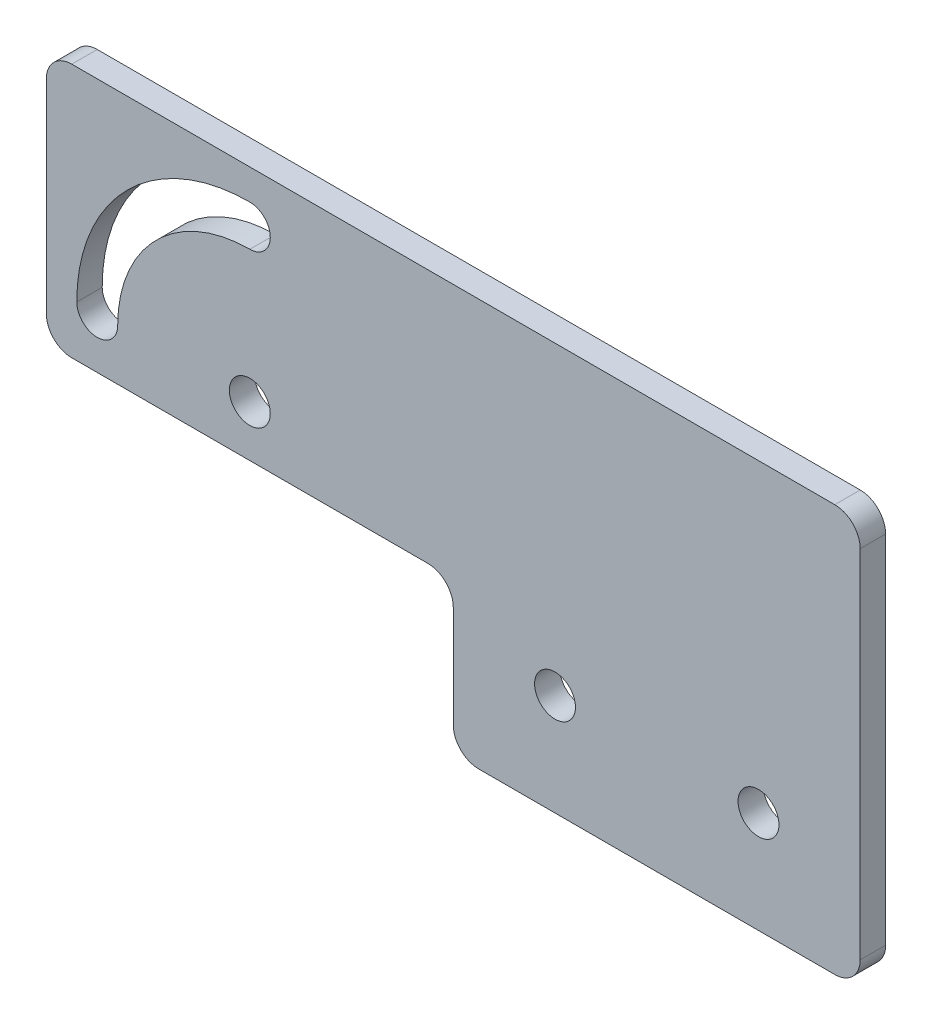
ISO-10303-21;
HEADER;
FILE_DESCRIPTION(('STEP AP214'),'2;1');
FILE_NAME('part.step','',(''),(''),'','','');
FILE_SCHEMA(('AUTOMOTIVE_DESIGN { 1 0 10303 214 1 1 1 1 }'));
ENDSEC;
DATA;
#1=APPLICATION_CONTEXT('core data for automotive mechanical design processes');
#2=APPLICATION_PROTOCOL_DEFINITION('international standard','automotive_design',2000,#1);
#3=PRODUCT_CONTEXT('',#1,'mechanical');
#4=PRODUCT('Part','Part','',(#3));
#5=PRODUCT_RELATED_PRODUCT_CATEGORY('part','',(#4));
#6=PRODUCT_DEFINITION_FORMATION('','',#4);
#7=PRODUCT_DEFINITION_CONTEXT('part definition',#1,'design');
#8=PRODUCT_DEFINITION('design','',#6,#7);
#9=PRODUCT_DEFINITION_SHAPE('','',#8);
#10=(LENGTH_UNIT() NAMED_UNIT(*) SI_UNIT(.MILLI.,.METRE.));
#11=(NAMED_UNIT(*) PLANE_ANGLE_UNIT() SI_UNIT($,.RADIAN.));
#12=(NAMED_UNIT(*) SI_UNIT($,.STERADIAN.) SOLID_ANGLE_UNIT());
#13=UNCERTAINTY_MEASURE_WITH_UNIT(LENGTH_MEASURE(1.E-05),#10,'distance_accuracy_value','');
#14=(GEOMETRIC_REPRESENTATION_CONTEXT(3) GLOBAL_UNCERTAINTY_ASSIGNED_CONTEXT((#13)) GLOBAL_UNIT_ASSIGNED_CONTEXT((#10,
#11,#12)) REPRESENTATION_CONTEXT('',''));
#15=CARTESIAN_POINT('',(0.,0.,0.));
#16=DIRECTION('',(0.,0.,1.));
#17=DIRECTION('',(1.,0.,0.));
#18=AXIS2_PLACEMENT_3D('',#15,#16,#17);
#19=CARTESIAN_POINT('',(-25.4,25.4,3.175));
#20=DIRECTION('',(0.,0.,-1.));
#21=DIRECTION('',(-1.,0.,0.));
#22=AXIS2_PLACEMENT_3D('',#19,#20,#21);
#23=CYLINDRICAL_SURFACE('',#22,21.6027);
#24=CARTESIAN_POINT('',(-25.4,25.4,0.));
#25=DIRECTION('',(0.,0.,1.));
#26=DIRECTION('',(1.,0.,0.));
#27=AXIS2_PLACEMENT_3D('',#24,#25,#26);
#28=CIRCLE('',#27,21.6027);
#29=CARTESIAN_POINT('',(-47.0027,25.4,0.));
#30=VERTEX_POINT('',#29);
#31=CARTESIAN_POINT('',(-25.4,47.0027,0.));
#32=VERTEX_POINT('',#31);
#33=EDGE_CURVE('E176',#30,#32,#28,.F.);
#34=ORIENTED_EDGE('',*,*,#33,.T.);
#35=DIRECTION('',(0.,0.,-1.));
#36=VECTOR('',#35,1.);
#37=CARTESIAN_POINT('',(-25.4,47.0027,3.175));
#38=LINE('',#37,#36);
#39=CARTESIAN_POINT('',(-25.4,47.0027,3.175));
#40=VERTEX_POINT('',#39);
#41=EDGE_CURVE('E157',#40,#32,#38,.T.);
#42=ORIENTED_EDGE('',*,*,#41,.F.);
#43=CARTESIAN_POINT('',(-25.4,25.4,3.175));
#44=DIRECTION('',(0.,0.,1.));
#45=DIRECTION('',(1.,0.,0.));
#46=AXIS2_PLACEMENT_3D('',#43,#44,#45);
#47=CIRCLE('',#46,21.6027);
#48=CARTESIAN_POINT('',(-47.0027,25.4,3.175));
#49=VERTEX_POINT('',#48);
#50=EDGE_CURVE('E164',#49,#40,#47,.F.);
#51=ORIENTED_EDGE('',*,*,#50,.F.);
#52=DIRECTION('',(0.,0.,-1.));
#53=VECTOR('',#52,1.);
#54=CARTESIAN_POINT('',(-47.0027,25.4,3.175));
#55=LINE('',#54,#53);
#56=EDGE_CURVE('E264',#49,#30,#55,.T.);
#57=ORIENTED_EDGE('',*,*,#56,.T.);
#58=EDGE_LOOP('',(#34,#42,#51,#57));
#59=FACE_BOUND('',#58,.T.);
#60=ADVANCED_FACE('F38',(#59),#23,.F.);
#61=CARTESIAN_POINT('',(-25.4,44.45,3.175));
#62=DIRECTION('',(0.,0.,-1.));
#63=DIRECTION('',(-1.,0.,0.));
#64=AXIS2_PLACEMENT_3D('',#61,#62,#63);
#65=CYLINDRICAL_SURFACE('',#64,2.5527);
#66=CARTESIAN_POINT('',(-25.4,44.45,0.));
#67=DIRECTION('',(0.,0.,1.));
#68=DIRECTION('',(1.,0.,0.));
#69=AXIS2_PLACEMENT_3D('',#66,#67,#68);
#70=CIRCLE('',#69,2.5527);
#71=CARTESIAN_POINT('',(-25.4,41.8973,0.));
#72=VERTEX_POINT('',#71);
#73=EDGE_CURVE('E287',#32,#72,#70,.F.);
#74=ORIENTED_EDGE('',*,*,#73,.T.);
#75=DIRECTION('',(0.,0.,-1.));
#76=VECTOR('',#75,1.);
#77=CARTESIAN_POINT('',(-25.4,41.8973,3.175));
#78=LINE('',#77,#76);
#79=CARTESIAN_POINT('',(-25.4,41.8973,3.175));
#80=VERTEX_POINT('',#79);
#81=EDGE_CURVE('E159',#80,#72,#78,.T.);
#82=ORIENTED_EDGE('',*,*,#81,.F.);
#83=CARTESIAN_POINT('',(-25.4,44.45,3.175));
#84=DIRECTION('',(0.,0.,1.));
#85=DIRECTION('',(1.,0.,0.));
#86=AXIS2_PLACEMENT_3D('',#83,#84,#85);
#87=CIRCLE('',#86,2.5527);
#88=EDGE_CURVE('E152',#40,#80,#87,.F.);
#89=ORIENTED_EDGE('',*,*,#88,.F.);
#90=ORIENTED_EDGE('',*,*,#41,.T.);
#91=EDGE_LOOP('',(#74,#82,#89,#90));
#92=FACE_BOUND('',#91,.T.);
#93=ADVANCED_FACE('F155',(#92),#65,.F.);
#94=CARTESIAN_POINT('',(-25.4,25.4,3.175));
#95=DIRECTION('',(0.,0.,-1.));
#96=DIRECTION('',(-1.,0.,0.));
#97=AXIS2_PLACEMENT_3D('',#94,#95,#96);
#98=CYLINDRICAL_SURFACE('',#97,16.4973);
#99=CARTESIAN_POINT('',(-25.4,25.4,0.));
#100=DIRECTION('',(0.,0.,1.));
#101=DIRECTION('',(1.,0.,0.));
#102=AXIS2_PLACEMENT_3D('',#99,#100,#101);
#103=CIRCLE('',#102,16.4973);
#104=CARTESIAN_POINT('',(-41.8973,25.4,0.));
#105=VERTEX_POINT('',#104);
#106=EDGE_CURVE('E289',#105,#72,#103,.F.);
#107=ORIENTED_EDGE('',*,*,#106,.F.);
#108=DIRECTION('',(0.,0.,-1.));
#109=VECTOR('',#108,1.);
#110=CARTESIAN_POINT('',(-41.8973,25.4,3.175));
#111=LINE('',#110,#109);
#112=CARTESIAN_POINT('',(-41.8973,25.4,3.175));
#113=VERTEX_POINT('',#112);
#114=EDGE_CURVE('E181',#113,#105,#111,.T.);
#115=ORIENTED_EDGE('',*,*,#114,.F.);
#116=CARTESIAN_POINT('',(-25.4,25.4,3.175));
#117=DIRECTION('',(0.,0.,1.));
#118=DIRECTION('',(1.,0.,0.));
#119=AXIS2_PLACEMENT_3D('',#116,#117,#118);
#120=CIRCLE('',#119,16.4973);
#121=EDGE_CURVE('E163',#113,#80,#120,.F.);
#122=ORIENTED_EDGE('',*,*,#121,.T.);
#123=ORIENTED_EDGE('',*,*,#81,.T.);
#124=EDGE_LOOP('',(#107,#115,#122,#123));
#125=FACE_BOUND('',#124,.T.);
#126=ADVANCED_FACE('F301',(#125),#98,.T.);
#127=CARTESIAN_POINT('',(0.,0.,3.175));
#128=DIRECTION('',(0.,1.,0.));
#129=DIRECTION('',(0.,0.,1.));
#130=AXIS2_PLACEMENT_3D('',#127,#128,#129);
#131=PLANE('',#130);
#132=DIRECTION('',(1.,0.,0.));
#133=VECTOR('',#132,1.);
#134=CARTESIAN_POINT('',(0.,0.,3.175));
#135=LINE('',#134,#133);
#136=CARTESIAN_POINT('',(3.175,0.,3.175));
#137=VERTEX_POINT('',#136);
#138=CARTESIAN_POINT('',(47.625,0.,3.175));
#139=VERTEX_POINT('',#138);
#140=EDGE_CURVE('E375',#137,#139,#135,.T.);
#141=ORIENTED_EDGE('',*,*,#140,.F.);
#142=DIRECTION('',(0.,0.,-1.));
#143=VECTOR('',#142,1.);
#144=CARTESIAN_POINT('',(3.175,0.,0.));
#145=LINE('',#144,#143);
#146=CARTESIAN_POINT('',(3.175,0.,0.));
#147=VERTEX_POINT('',#146);
#148=EDGE_CURVE('E179',#137,#147,#145,.T.);
#149=ORIENTED_EDGE('',*,*,#148,.T.);
#150=DIRECTION('',(1.,0.,0.));
#151=VECTOR('',#150,1.);
#152=CARTESIAN_POINT('',(0.,0.,0.));
#153=LINE('',#152,#151);
#154=CARTESIAN_POINT('',(47.625,0.,0.));
#155=VERTEX_POINT('',#154);
#156=EDGE_CURVE('E271',#147,#155,#153,.T.);
#157=ORIENTED_EDGE('',*,*,#156,.T.);
#158=DIRECTION('',(0.,0.,-1.));
#159=VECTOR('',#158,1.);
#160=CARTESIAN_POINT('',(47.625,0.,3.175));
#161=LINE('',#160,#159);
#162=EDGE_CURVE('E177',#155,#139,#161,.F.);
#163=ORIENTED_EDGE('',*,*,#162,.T.);
#164=EDGE_LOOP('',(#141,#149,#157,#163));
#165=FACE_BOUND('',#164,.T.);
#166=ADVANCED_FACE('F303',(#165),#131,.F.);
#167=CARTESIAN_POINT('',(50.8,0.,3.175));
#168=DIRECTION('',(-1.,0.,0.));
#169=DIRECTION('',(0.,0.,1.));
#170=AXIS2_PLACEMENT_3D('',#167,#168,#169);
#171=PLANE('',#170);
#172=DIRECTION('',(0.,1.,0.));
#173=VECTOR('',#172,1.);
#174=CARTESIAN_POINT('',(50.8,0.,0.));
#175=LINE('',#174,#173);
#176=CARTESIAN_POINT('',(50.8,3.175,0.));
#177=VERTEX_POINT('',#176);
#178=CARTESIAN_POINT('',(50.8,47.625,0.));
#179=VERTEX_POINT('',#178);
#180=EDGE_CURVE('E274',#177,#179,#175,.T.);
#181=ORIENTED_EDGE('',*,*,#180,.T.);
#182=DIRECTION('',(0.,0.,-1.));
#183=VECTOR('',#182,1.);
#184=CARTESIAN_POINT('',(50.8,47.625,3.175));
#185=LINE('',#184,#183);
#186=CARTESIAN_POINT('',(50.8,47.625,3.175));
#187=VERTEX_POINT('',#186);
#188=EDGE_CURVE('E228',#179,#187,#185,.F.);
#189=ORIENTED_EDGE('',*,*,#188,.T.);
#190=DIRECTION('',(0.,1.,0.));
#191=VECTOR('',#190,1.);
#192=CARTESIAN_POINT('',(50.8,0.,3.175));
#193=LINE('',#192,#191);
#194=CARTESIAN_POINT('',(50.8,3.175,3.175));
#195=VERTEX_POINT('',#194);
#196=EDGE_CURVE('E372',#195,#187,#193,.T.);
#197=ORIENTED_EDGE('',*,*,#196,.F.);
#198=DIRECTION('',(0.,0.,-1.));
#199=VECTOR('',#198,1.);
#200=CARTESIAN_POINT('',(50.8,3.175,3.175));
#201=LINE('',#200,#199);
#202=EDGE_CURVE('E225',#195,#177,#201,.T.);
#203=ORIENTED_EDGE('',*,*,#202,.T.);
#204=EDGE_LOOP('',(#181,#189,#197,#203));
#205=FACE_BOUND('',#204,.T.);
#206=ADVANCED_FACE('F309',(#205),#171,.F.);
#207=CARTESIAN_POINT('',(0.,50.8,3.175));
#208=DIRECTION('',(0.,1.,0.));
#209=DIRECTION('',(0.,0.,1.));
#210=AXIS2_PLACEMENT_3D('',#207,#208,#209);
#211=PLANE('',#210);
#212=DIRECTION('',(1.,0.,0.));
#213=VECTOR('',#212,1.);
#214=CARTESIAN_POINT('',(0.,50.8,3.175));
#215=LINE('',#214,#213);
#216=CARTESIAN_POINT('',(-47.625,50.8,3.175));
#217=VERTEX_POINT('',#216);
#218=CARTESIAN_POINT('',(47.625,50.8,3.175));
#219=VERTEX_POINT('',#218);
#220=EDGE_CURVE('E378',#217,#219,#215,.T.);
#221=ORIENTED_EDGE('',*,*,#220,.T.);
#222=DIRECTION('',(0.,0.,-1.));
#223=VECTOR('',#222,1.);
#224=CARTESIAN_POINT('',(47.625,50.8,0.));
#225=LINE('',#224,#223);
#226=CARTESIAN_POINT('',(47.625,50.8,0.));
#227=VERTEX_POINT('',#226);
#228=EDGE_CURVE('E222',#219,#227,#225,.T.);
#229=ORIENTED_EDGE('',*,*,#228,.T.);
#230=DIRECTION('',(1.,0.,0.));
#231=VECTOR('',#230,1.);
#232=CARTESIAN_POINT('',(0.,50.8,0.));
#233=LINE('',#232,#231);
#234=CARTESIAN_POINT('',(-47.625,50.8,0.));
#235=VERTEX_POINT('',#234);
#236=EDGE_CURVE('E277',#235,#227,#233,.T.);
#237=ORIENTED_EDGE('',*,*,#236,.F.);
#238=DIRECTION('',(0.,0.,-1.));
#239=VECTOR('',#238,1.);
#240=CARTESIAN_POINT('',(-47.625,50.8,3.175));
#241=LINE('',#240,#239);
#242=EDGE_CURVE('E220',#235,#217,#241,.F.);
#243=ORIENTED_EDGE('',*,*,#242,.T.);
#244=EDGE_LOOP('',(#221,#229,#237,#243));
#245=FACE_BOUND('',#244,.T.);
#246=ADVANCED_FACE('F331',(#245),#211,.T.);
#247=CARTESIAN_POINT('',(-50.8,0.,3.175));
#248=DIRECTION('',(1.,0.,0.));
#249=DIRECTION('',(0.,1.,0.));
#250=AXIS2_PLACEMENT_3D('',#247,#248,#249);
#251=PLANE('',#250);
#252=DIRECTION('',(0.,-1.,0.));
#253=VECTOR('',#252,1.);
#254=CARTESIAN_POINT('',(-50.8,0.,0.));
#255=LINE('',#254,#253);
#256=CARTESIAN_POINT('',(-50.8,47.625,0.));
#257=VERTEX_POINT('',#256);
#258=CARTESIAN_POINT('',(-50.8,22.225,0.));
#259=VERTEX_POINT('',#258);
#260=EDGE_CURVE('E242',#257,#259,#255,.T.);
#261=ORIENTED_EDGE('',*,*,#260,.T.);
#262=DIRECTION('',(0.,0.,-1.));
#263=VECTOR('',#262,1.);
#264=CARTESIAN_POINT('',(-50.8,22.225,3.175));
#265=LINE('',#264,#263);
#266=CARTESIAN_POINT('',(-50.8,22.225,3.175));
#267=VERTEX_POINT('',#266);
#268=EDGE_CURVE('E218',#259,#267,#265,.F.);
#269=ORIENTED_EDGE('',*,*,#268,.T.);
#270=DIRECTION('',(0.,-1.,0.));
#271=VECTOR('',#270,1.);
#272=CARTESIAN_POINT('',(-50.8,0.,3.175));
#273=LINE('',#272,#271);
#274=CARTESIAN_POINT('',(-50.8,47.625,3.175));
#275=VERTEX_POINT('',#274);
#276=EDGE_CURVE('E258',#275,#267,#273,.T.);
#277=ORIENTED_EDGE('',*,*,#276,.F.);
#278=DIRECTION('',(0.,0.,-1.));
#279=VECTOR('',#278,1.);
#280=CARTESIAN_POINT('',(-50.8,47.625,0.));
#281=LINE('',#280,#279);
#282=EDGE_CURVE('E215',#275,#257,#281,.T.);
#283=ORIENTED_EDGE('',*,*,#282,.T.);
#284=EDGE_LOOP('',(#261,#269,#277,#283));
#285=FACE_BOUND('',#284,.T.);
#286=ADVANCED_FACE('F328',(#285),#251,.F.);
#287=CARTESIAN_POINT('',(0.,19.05,3.175));
#288=DIRECTION('',(0.,1.,0.));
#289=DIRECTION('',(-1.,0.,0.));
#290=AXIS2_PLACEMENT_3D('',#287,#288,#289);
#291=PLANE('',#290);
#292=DIRECTION('',(1.,0.,0.));
#293=VECTOR('',#292,1.);
#294=CARTESIAN_POINT('',(0.,19.05,0.));
#295=LINE('',#294,#293);
#296=CARTESIAN_POINT('',(-47.625,19.05,0.));
#297=VERTEX_POINT('',#296);
#298=CARTESIAN_POINT('',(-3.175,19.05,0.));
#299=VERTEX_POINT('',#298);
#300=EDGE_CURVE('E235',#297,#299,#295,.T.);
#301=ORIENTED_EDGE('',*,*,#300,.T.);
#302=DIRECTION('',(0.,0.,-1.));
#303=VECTOR('',#302,1.);
#304=CARTESIAN_POINT('',(-3.175,19.05,3.175));
#305=LINE('',#304,#303);
#306=CARTESIAN_POINT('',(-3.175,19.05,3.175));
#307=VERTEX_POINT('',#306);
#308=EDGE_CURVE('E53',#299,#307,#305,.F.);
#309=ORIENTED_EDGE('',*,*,#308,.T.);
#310=DIRECTION('',(1.,0.,0.));
#311=VECTOR('',#310,1.);
#312=CARTESIAN_POINT('',(0.,19.05,3.175));
#313=LINE('',#312,#311);
#314=CARTESIAN_POINT('',(-47.625,19.05,3.175));
#315=VERTEX_POINT('',#314);
#316=EDGE_CURVE('E251',#315,#307,#313,.T.);
#317=ORIENTED_EDGE('',*,*,#316,.F.);
#318=DIRECTION('',(0.,0.,-1.));
#319=VECTOR('',#318,1.);
#320=CARTESIAN_POINT('',(-47.625,19.05,3.175));
#321=LINE('',#320,#319);
#322=EDGE_CURVE('E211',#315,#297,#321,.T.);
#323=ORIENTED_EDGE('',*,*,#322,.T.);
#324=EDGE_LOOP('',(#301,#309,#317,#323));
#325=FACE_BOUND('',#324,.T.);
#326=ADVANCED_FACE('F240',(#325),#291,.F.);
#327=CARTESIAN_POINT('',(-25.4,25.4,3.175));
#328=DIRECTION('',(0.,0.,-1.));
#329=DIRECTION('',(-1.,0.,0.));
#330=AXIS2_PLACEMENT_3D('',#327,#328,#329);
#331=CYLINDRICAL_SURFACE('',#330,2.5527);
#332=CARTESIAN_POINT('',(-25.4,25.4,3.175));
#333=DIRECTION('',(0.,0.,1.));
#334=DIRECTION('',(1.,0.,0.));
#335=AXIS2_PLACEMENT_3D('',#332,#333,#334);
#336=CIRCLE('',#335,2.5527);
#337=CARTESIAN_POINT('',(-22.8473,25.4,3.175));
#338=VERTEX_POINT('',#337);
#339=EDGE_CURVE('E173',#338,#338,#336,.T.);
#340=ORIENTED_EDGE('',*,*,#339,.T.);
#341=EDGE_LOOP('',(#340));
#342=FACE_BOUND('',#341,.T.);
#343=CARTESIAN_POINT('',(-25.4,25.4,0.));
#344=DIRECTION('',(0.,0.,1.));
#345=DIRECTION('',(1.,0.,0.));
#346=AXIS2_PLACEMENT_3D('',#343,#344,#345);
#347=CIRCLE('',#346,2.5527);
#348=CARTESIAN_POINT('',(-22.8473,25.4,0.));
#349=VERTEX_POINT('',#348);
#350=EDGE_CURVE('E283',#349,#349,#347,.T.);
#351=ORIENTED_EDGE('',*,*,#350,.F.);
#352=EDGE_LOOP('',(#351));
#353=FACE_BOUND('',#352,.T.);
#354=ADVANCED_FACE('F319',(#342,#353),#331,.F.);
#355=CARTESIAN_POINT('',(0.,0.,3.175));
#356=DIRECTION('',(-1.,0.,0.));
#357=DIRECTION('',(0.,0.,1.));
#358=AXIS2_PLACEMENT_3D('',#355,#356,#357);
#359=PLANE('',#358);
#360=DIRECTION('',(0.,1.,0.));
#361=VECTOR('',#360,1.);
#362=CARTESIAN_POINT('',(0.,0.,0.));
#363=LINE('',#362,#361);
#364=CARTESIAN_POINT('',(0.,3.175,0.));
#365=VERTEX_POINT('',#364);
#366=CARTESIAN_POINT('',(0.,15.875,0.));
#367=VERTEX_POINT('',#366);
#368=EDGE_CURVE('E237',#365,#367,#363,.T.);
#369=ORIENTED_EDGE('',*,*,#368,.F.);
#370=DIRECTION('',(0.,0.,-1.));
#371=VECTOR('',#370,1.);
#372=CARTESIAN_POINT('',(0.,3.175,3.175));
#373=LINE('',#372,#371);
#374=CARTESIAN_POINT('',(0.,3.175,3.175));
#375=VERTEX_POINT('',#374);
#376=EDGE_CURVE('E200',#365,#375,#373,.F.);
#377=ORIENTED_EDGE('',*,*,#376,.T.);
#378=DIRECTION('',(0.,1.,0.));
#379=VECTOR('',#378,1.);
#380=CARTESIAN_POINT('',(0.,0.,3.175));
#381=LINE('',#380,#379);
#382=CARTESIAN_POINT('',(0.,15.875,3.175));
#383=VERTEX_POINT('',#382);
#384=EDGE_CURVE('E249',#375,#383,#381,.T.);
#385=ORIENTED_EDGE('',*,*,#384,.T.);
#386=DIRECTION('',(0.,0.,-1.));
#387=VECTOR('',#386,1.);
#388=CARTESIAN_POINT('',(0.,15.875,3.175));
#389=LINE('',#388,#387);
#390=EDGE_CURVE('E197',#383,#367,#389,.T.);
#391=ORIENTED_EDGE('',*,*,#390,.T.);
#392=EDGE_LOOP('',(#369,#377,#385,#391));
#393=FACE_BOUND('',#392,.T.);
#394=ADVANCED_FACE('F253',(#393),#359,.T.);
#395=CARTESIAN_POINT('',(12.7,12.7,3.175));
#396=DIRECTION('',(0.,0.,-1.));
#397=DIRECTION('',(-1.,0.,0.));
#398=AXIS2_PLACEMENT_3D('',#395,#396,#397);
#399=CYLINDRICAL_SURFACE('',#398,2.5527);
#400=CARTESIAN_POINT('',(12.7,12.7,3.175));
#401=DIRECTION('',(0.,0.,1.));
#402=DIRECTION('',(1.,0.,0.));
#403=AXIS2_PLACEMENT_3D('',#400,#401,#402);
#404=CIRCLE('',#403,2.5527);
#405=CARTESIAN_POINT('',(15.2527,12.7,3.175));
#406=VERTEX_POINT('',#405);
#407=EDGE_CURVE('E382',#406,#406,#404,.T.);
#408=ORIENTED_EDGE('',*,*,#407,.T.);
#409=EDGE_LOOP('',(#408));
#410=FACE_BOUND('',#409,.T.);
#411=CARTESIAN_POINT('',(12.7,12.7,0.));
#412=DIRECTION('',(0.,0.,1.));
#413=DIRECTION('',(1.,0.,0.));
#414=AXIS2_PLACEMENT_3D('',#411,#412,#413);
#415=CIRCLE('',#414,2.5527);
#416=CARTESIAN_POINT('',(15.2527,12.7,0.));
#417=VERTEX_POINT('',#416);
#418=EDGE_CURVE('E268',#417,#417,#415,.T.);
#419=ORIENTED_EDGE('',*,*,#418,.F.);
#420=EDGE_LOOP('',(#419));
#421=FACE_BOUND('',#420,.T.);
#422=ADVANCED_FACE('F325',(#410,#421),#399,.F.);
#423=CARTESIAN_POINT('',(38.1,12.7,3.175));
#424=DIRECTION('',(0.,0.,-1.));
#425=DIRECTION('',(-1.,0.,0.));
#426=AXIS2_PLACEMENT_3D('',#423,#424,#425);
#427=CYLINDRICAL_SURFACE('',#426,2.5527);
#428=CARTESIAN_POINT('',(38.1,12.7,3.175));
#429=DIRECTION('',(0.,0.,1.));
#430=DIRECTION('',(1.,0.,0.));
#431=AXIS2_PLACEMENT_3D('',#428,#429,#430);
#432=CIRCLE('',#431,2.5527);
#433=CARTESIAN_POINT('',(40.6527,12.7,3.175));
#434=VERTEX_POINT('',#433);
#435=EDGE_CURVE('E294',#434,#434,#432,.T.);
#436=ORIENTED_EDGE('',*,*,#435,.T.);
#437=EDGE_LOOP('',(#436));
#438=FACE_BOUND('',#437,.T.);
#439=CARTESIAN_POINT('',(38.1,12.7,0.));
#440=DIRECTION('',(0.,0.,1.));
#441=DIRECTION('',(1.,0.,0.));
#442=AXIS2_PLACEMENT_3D('',#439,#440,#441);
#443=CIRCLE('',#442,2.5527);
#444=CARTESIAN_POINT('',(40.6527,12.7,0.));
#445=VERTEX_POINT('',#444);
#446=EDGE_CURVE('E265',#445,#445,#443,.T.);
#447=ORIENTED_EDGE('',*,*,#446,.F.);
#448=EDGE_LOOP('',(#447));
#449=FACE_BOUND('',#448,.T.);
#450=ADVANCED_FACE('F341',(#438,#449),#427,.F.);
#451=CARTESIAN_POINT('',(-44.45,25.4,3.175));
#452=DIRECTION('',(0.,0.,-1.));
#453=DIRECTION('',(-1.,0.,0.));
#454=AXIS2_PLACEMENT_3D('',#451,#452,#453);
#455=CYLINDRICAL_SURFACE('',#454,2.5527);
#456=CARTESIAN_POINT('',(-44.45,25.4,0.));
#457=DIRECTION('',(0.,0.,1.));
#458=DIRECTION('',(1.,0.,0.));
#459=AXIS2_PLACEMENT_3D('',#456,#457,#458);
#460=CIRCLE('',#459,2.5527);
#461=EDGE_CURVE('E292',#105,#30,#460,.F.);
#462=ORIENTED_EDGE('',*,*,#461,.T.);
#463=ORIENTED_EDGE('',*,*,#56,.F.);
#464=CARTESIAN_POINT('',(-44.45,25.4,3.175));
#465=DIRECTION('',(0.,0.,1.));
#466=DIRECTION('',(1.,0.,0.));
#467=AXIS2_PLACEMENT_3D('',#464,#465,#466);
#468=CIRCLE('',#467,2.5527);
#469=EDGE_CURVE('E169',#113,#49,#468,.F.);
#470=ORIENTED_EDGE('',*,*,#469,.F.);
#471=ORIENTED_EDGE('',*,*,#114,.T.);
#472=EDGE_LOOP('',(#462,#463,#470,#471));
#473=FACE_BOUND('',#472,.T.);
#474=ADVANCED_FACE('F297',(#473),#455,.F.);
#475=CARTESIAN_POINT('',(0.,0.,3.175));
#476=DIRECTION('',(0.,0.,1.));
#477=DIRECTION('',(1.,0.,0.));
#478=AXIS2_PLACEMENT_3D('',#475,#476,#477);
#479=PLANE('',#478);
#480=ORIENTED_EDGE('',*,*,#435,.F.);
#481=EDGE_LOOP('',(#480));
#482=FACE_BOUND('',#481,.T.);
#483=ORIENTED_EDGE('',*,*,#407,.F.);
#484=EDGE_LOOP('',(#483));
#485=FACE_BOUND('',#484,.T.);
#486=ORIENTED_EDGE('',*,*,#384,.F.);
#487=CARTESIAN_POINT('',(3.175,3.175,3.175));
#488=DIRECTION('',(0.,0.,1.));
#489=DIRECTION('',(1.,0.,0.));
#490=AXIS2_PLACEMENT_3D('',#487,#488,#489);
#491=CIRCLE('',#490,3.175);
#492=EDGE_CURVE('E209',#375,#137,#491,.T.);
#493=ORIENTED_EDGE('',*,*,#492,.T.);
#494=ORIENTED_EDGE('',*,*,#140,.T.);
#495=CARTESIAN_POINT('',(47.625,3.175,3.175));
#496=DIRECTION('',(0.,0.,1.));
#497=DIRECTION('',(1.,0.,0.));
#498=AXIS2_PLACEMENT_3D('',#495,#496,#497);
#499=CIRCLE('',#498,3.175);
#500=EDGE_CURVE('E204',#139,#195,#499,.T.);
#501=ORIENTED_EDGE('',*,*,#500,.T.);
#502=ORIENTED_EDGE('',*,*,#196,.T.);
#503=CARTESIAN_POINT('',(47.625,47.625,3.175));
#504=DIRECTION('',(0.,0.,1.));
#505=DIRECTION('',(1.,0.,0.));
#506=AXIS2_PLACEMENT_3D('',#503,#504,#505);
#507=CIRCLE('',#506,3.175);
#508=EDGE_CURVE('E206',#187,#219,#507,.T.);
#509=ORIENTED_EDGE('',*,*,#508,.T.);
#510=ORIENTED_EDGE('',*,*,#220,.F.);
#511=CARTESIAN_POINT('',(-47.625,47.625,3.175));
#512=DIRECTION('',(0.,0.,1.));
#513=DIRECTION('',(1.,0.,0.));
#514=AXIS2_PLACEMENT_3D('',#511,#512,#513);
#515=CIRCLE('',#514,3.175);
#516=EDGE_CURVE('E202',#217,#275,#515,.T.);
#517=ORIENTED_EDGE('',*,*,#516,.T.);
#518=ORIENTED_EDGE('',*,*,#276,.T.);
#519=CARTESIAN_POINT('',(-47.625,22.225,3.175));
#520=DIRECTION('',(0.,0.,1.));
#521=DIRECTION('',(1.,0.,0.));
#522=AXIS2_PLACEMENT_3D('',#519,#520,#521);
#523=CIRCLE('',#522,3.175);
#524=EDGE_CURVE('E60',#267,#315,#523,.T.);
#525=ORIENTED_EDGE('',*,*,#524,.T.);
#526=ORIENTED_EDGE('',*,*,#316,.T.);
#527=CARTESIAN_POINT('',(-3.175,15.875,3.175));
#528=DIRECTION('',(0.,0.,1.));
#529=DIRECTION('',(1.,0.,0.));
#530=AXIS2_PLACEMENT_3D('',#527,#528,#529);
#531=CIRCLE('',#530,3.175);
#532=EDGE_CURVE('E11',#307,#383,#531,.F.);
#533=ORIENTED_EDGE('',*,*,#532,.T.);
#534=EDGE_LOOP('',(#486,#493,#494,#501,#502,#509,#510,#517,#518,#525,#526,#533));
#535=FACE_BOUND('',#534,.T.);
#536=ORIENTED_EDGE('',*,*,#339,.F.);
#537=EDGE_LOOP('',(#536));
#538=FACE_BOUND('',#537,.T.);
#539=ORIENTED_EDGE('',*,*,#50,.T.);
#540=ORIENTED_EDGE('',*,*,#88,.T.);
#541=ORIENTED_EDGE('',*,*,#121,.F.);
#542=ORIENTED_EDGE('',*,*,#469,.T.);
#543=EDGE_LOOP('',(#539,#540,#541,#542));
#544=FACE_BOUND('',#543,.T.);
#545=ADVANCED_FACE('F167',(#482,#485,#535,#538,#544),#479,.T.);
#546=CARTESIAN_POINT('',(0.,0.,0.));
#547=DIRECTION('',(0.,0.,1.));
#548=DIRECTION('',(1.,0.,0.));
#549=AXIS2_PLACEMENT_3D('',#546,#547,#548);
#550=PLANE('',#549);
#551=ORIENTED_EDGE('',*,*,#446,.T.);
#552=EDGE_LOOP('',(#551));
#553=FACE_BOUND('',#552,.T.);
#554=ORIENTED_EDGE('',*,*,#418,.T.);
#555=EDGE_LOOP('',(#554));
#556=FACE_BOUND('',#555,.T.);
#557=ORIENTED_EDGE('',*,*,#156,.F.);
#558=CARTESIAN_POINT('',(3.175,3.175,0.));
#559=DIRECTION('',(0.,0.,1.));
#560=DIRECTION('',(1.,0.,0.));
#561=AXIS2_PLACEMENT_3D('',#558,#559,#560);
#562=CIRCLE('',#561,3.175);
#563=EDGE_CURVE('E195',#147,#365,#562,.F.);
#564=ORIENTED_EDGE('',*,*,#563,.T.);
#565=ORIENTED_EDGE('',*,*,#368,.T.);
#566=CARTESIAN_POINT('',(-3.175,15.875,0.));
#567=DIRECTION('',(0.,0.,1.));
#568=DIRECTION('',(1.,0.,0.));
#569=AXIS2_PLACEMENT_3D('',#566,#567,#568);
#570=CIRCLE('',#569,3.175);
#571=EDGE_CURVE('E46',#367,#299,#570,.T.);
#572=ORIENTED_EDGE('',*,*,#571,.T.);
#573=ORIENTED_EDGE('',*,*,#300,.F.);
#574=CARTESIAN_POINT('',(-47.625,22.225,0.));
#575=DIRECTION('',(0.,0.,1.));
#576=DIRECTION('',(1.,0.,0.));
#577=AXIS2_PLACEMENT_3D('',#574,#575,#576);
#578=CIRCLE('',#577,3.175);
#579=EDGE_CURVE('E193',#297,#259,#578,.F.);
#580=ORIENTED_EDGE('',*,*,#579,.T.);
#581=ORIENTED_EDGE('',*,*,#260,.F.);
#582=CARTESIAN_POINT('',(-47.625,47.625,0.));
#583=DIRECTION('',(0.,0.,1.));
#584=DIRECTION('',(1.,0.,0.));
#585=AXIS2_PLACEMENT_3D('',#582,#583,#584);
#586=CIRCLE('',#585,3.175);
#587=EDGE_CURVE('E187',#257,#235,#586,.F.);
#588=ORIENTED_EDGE('',*,*,#587,.T.);
#589=ORIENTED_EDGE('',*,*,#236,.T.);
#590=CARTESIAN_POINT('',(47.625,47.625,0.));
#591=DIRECTION('',(0.,0.,1.));
#592=DIRECTION('',(1.,0.,0.));
#593=AXIS2_PLACEMENT_3D('',#590,#591,#592);
#594=CIRCLE('',#593,3.175);
#595=EDGE_CURVE('E191',#227,#179,#594,.F.);
#596=ORIENTED_EDGE('',*,*,#595,.T.);
#597=ORIENTED_EDGE('',*,*,#180,.F.);
#598=CARTESIAN_POINT('',(47.625,3.175,0.));
#599=DIRECTION('',(0.,0.,1.));
#600=DIRECTION('',(1.,0.,0.));
#601=AXIS2_PLACEMENT_3D('',#598,#599,#600);
#602=CIRCLE('',#601,3.175);
#603=EDGE_CURVE('E189',#177,#155,#602,.F.);
#604=ORIENTED_EDGE('',*,*,#603,.T.);
#605=EDGE_LOOP('',(#557,#564,#565,#572,#573,#580,#581,#588,#589,#596,#597,#604));
#606=FACE_BOUND('',#605,.T.);
#607=ORIENTED_EDGE('',*,*,#350,.T.);
#608=EDGE_LOOP('',(#607));
#609=FACE_BOUND('',#608,.T.);
#610=ORIENTED_EDGE('',*,*,#33,.F.);
#611=ORIENTED_EDGE('',*,*,#461,.F.);
#612=ORIENTED_EDGE('',*,*,#106,.T.);
#613=ORIENTED_EDGE('',*,*,#73,.F.);
#614=EDGE_LOOP('',(#610,#611,#612,#613));
#615=FACE_BOUND('',#614,.T.);
#616=ADVANCED_FACE('F233',(#553,#556,#606,#609,#615),#550,.F.);
#617=CARTESIAN_POINT('',(3.175,3.175,3.175));
#618=DIRECTION('',(0.,0.,1.));
#619=DIRECTION('',(1.,0.,0.));
#620=AXIS2_PLACEMENT_3D('',#617,#618,#619);
#621=CYLINDRICAL_SURFACE('',#620,3.175);
#622=ORIENTED_EDGE('',*,*,#492,.F.);
#623=ORIENTED_EDGE('',*,*,#376,.F.);
#624=ORIENTED_EDGE('',*,*,#563,.F.);
#625=ORIENTED_EDGE('',*,*,#148,.F.);
#626=EDGE_LOOP('',(#622,#623,#624,#625));
#627=FACE_BOUND('',#626,.T.);
#628=ADVANCED_FACE('F346',(#627),#621,.T.);
#629=CARTESIAN_POINT('',(-3.175,15.875,3.175));
#630=DIRECTION('',(0.,0.,-1.));
#631=DIRECTION('',(-1.,0.,0.));
#632=AXIS2_PLACEMENT_3D('',#629,#630,#631);
#633=CYLINDRICAL_SURFACE('',#632,3.175);
#634=ORIENTED_EDGE('',*,*,#532,.F.);
#635=ORIENTED_EDGE('',*,*,#308,.F.);
#636=ORIENTED_EDGE('',*,*,#571,.F.);
#637=ORIENTED_EDGE('',*,*,#390,.F.);
#638=EDGE_LOOP('',(#634,#635,#636,#637));
#639=FACE_BOUND('',#638,.T.);
#640=ADVANCED_FACE('F245',(#639),#633,.F.);
#641=CARTESIAN_POINT('',(-47.625,22.225,3.175));
#642=DIRECTION('',(0.,0.,-1.));
#643=DIRECTION('',(-1.,0.,0.));
#644=AXIS2_PLACEMENT_3D('',#641,#642,#643);
#645=CYLINDRICAL_SURFACE('',#644,3.175);
#646=ORIENTED_EDGE('',*,*,#524,.F.);
#647=ORIENTED_EDGE('',*,*,#268,.F.);
#648=ORIENTED_EDGE('',*,*,#579,.F.);
#649=ORIENTED_EDGE('',*,*,#322,.F.);
#650=EDGE_LOOP('',(#646,#647,#648,#649));
#651=FACE_BOUND('',#650,.T.);
#652=ADVANCED_FACE('F352',(#651),#645,.T.);
#653=CARTESIAN_POINT('',(47.625,47.625,3.175));
#654=DIRECTION('',(0.,0.,1.));
#655=DIRECTION('',(1.,0.,0.));
#656=AXIS2_PLACEMENT_3D('',#653,#654,#655);
#657=CYLINDRICAL_SURFACE('',#656,3.175);
#658=ORIENTED_EDGE('',*,*,#508,.F.);
#659=ORIENTED_EDGE('',*,*,#188,.F.);
#660=ORIENTED_EDGE('',*,*,#595,.F.);
#661=ORIENTED_EDGE('',*,*,#228,.F.);
#662=EDGE_LOOP('',(#658,#659,#660,#661));
#663=FACE_BOUND('',#662,.T.);
#664=ADVANCED_FACE('F355',(#663),#657,.T.);
#665=CARTESIAN_POINT('',(47.625,3.175,3.175));
#666=DIRECTION('',(0.,0.,-1.));
#667=DIRECTION('',(-1.,0.,0.));
#668=AXIS2_PLACEMENT_3D('',#665,#666,#667);
#669=CYLINDRICAL_SURFACE('',#668,3.175);
#670=ORIENTED_EDGE('',*,*,#500,.F.);
#671=ORIENTED_EDGE('',*,*,#162,.F.);
#672=ORIENTED_EDGE('',*,*,#603,.F.);
#673=ORIENTED_EDGE('',*,*,#202,.F.);
#674=EDGE_LOOP('',(#670,#671,#672,#673));
#675=FACE_BOUND('',#674,.T.);
#676=ADVANCED_FACE('F358',(#675),#669,.T.);
#677=CARTESIAN_POINT('',(-47.625,47.625,3.175));
#678=DIRECTION('',(0.,0.,1.));
#679=DIRECTION('',(1.,0.,0.));
#680=AXIS2_PLACEMENT_3D('',#677,#678,#679);
#681=CYLINDRICAL_SURFACE('',#680,3.175);
#682=ORIENTED_EDGE('',*,*,#516,.F.);
#683=ORIENTED_EDGE('',*,*,#242,.F.);
#684=ORIENTED_EDGE('',*,*,#587,.F.);
#685=ORIENTED_EDGE('',*,*,#282,.F.);
#686=EDGE_LOOP('',(#682,#683,#684,#685));
#687=FACE_BOUND('',#686,.T.);
#688=ADVANCED_FACE('F40',(#687),#681,.T.);
#689=CLOSED_SHELL('',(#60,#93,#126,#166,#206,#246,#286,#326,#354,#394,#422,#450,#474,#545,#616,
#628,#640,#652,#664,#676,#688));
#690=MANIFOLD_SOLID_BREP('B2',#689);
#691=ADVANCED_BREP_SHAPE_REPRESENTATION('',(#18,#690),#14);
#692=SHAPE_DEFINITION_REPRESENTATION(#9,#691);
ENDSEC;
END-ISO-10303-21;
